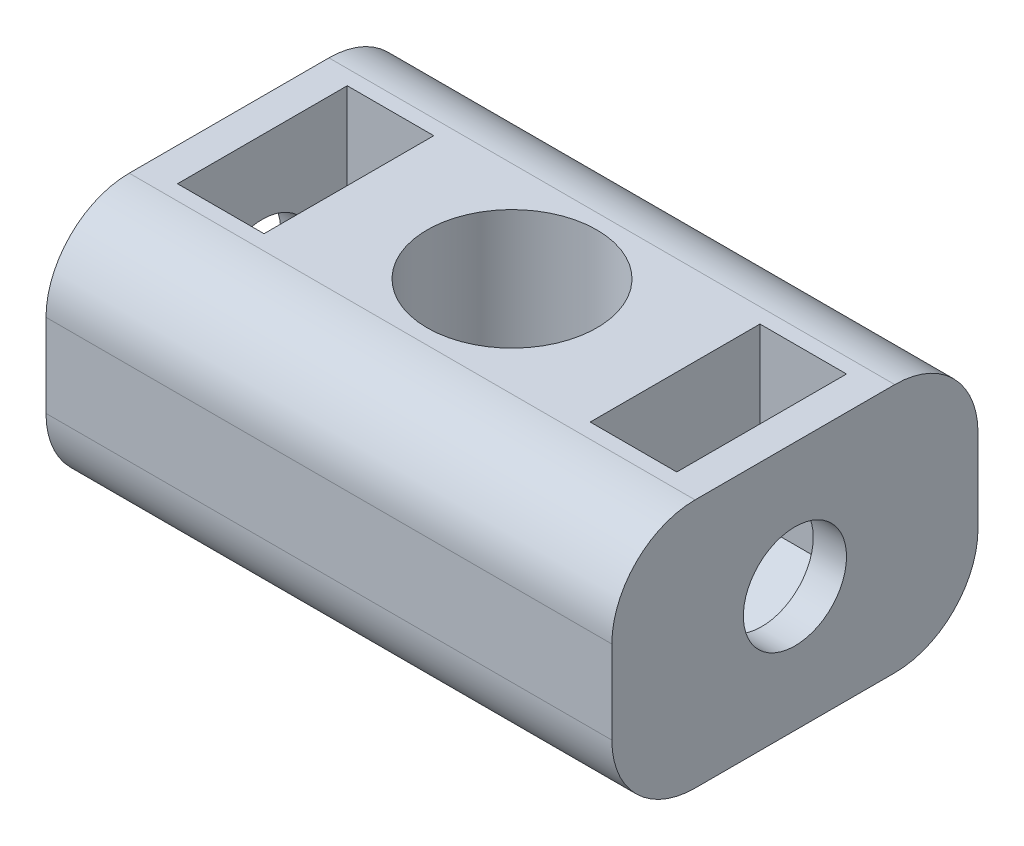
ISO-10303-21;
HEADER;
FILE_DESCRIPTION(('STEP AP214'),'2;1');
FILE_NAME('part.step','',(''),(''),'','','');
FILE_SCHEMA(('AUTOMOTIVE_DESIGN { 1 0 10303 214 1 1 1 1 }'));
ENDSEC;
DATA;
#1=APPLICATION_CONTEXT('core data for automotive mechanical design processes');
#2=APPLICATION_PROTOCOL_DEFINITION('international standard','automotive_design',2000,#1);
#3=PRODUCT_CONTEXT('',#1,'mechanical');
#4=PRODUCT('Part','Part','',(#3));
#5=PRODUCT_RELATED_PRODUCT_CATEGORY('part','',(#4));
#6=PRODUCT_DEFINITION_FORMATION('','',#4);
#7=PRODUCT_DEFINITION_CONTEXT('part definition',#1,'design');
#8=PRODUCT_DEFINITION('design','',#6,#7);
#9=PRODUCT_DEFINITION_SHAPE('','',#8);
#10=(LENGTH_UNIT() NAMED_UNIT(*) SI_UNIT(.MILLI.,.METRE.));
#11=(NAMED_UNIT(*) PLANE_ANGLE_UNIT() SI_UNIT($,.RADIAN.));
#12=(NAMED_UNIT(*) SI_UNIT($,.STERADIAN.) SOLID_ANGLE_UNIT());
#13=UNCERTAINTY_MEASURE_WITH_UNIT(LENGTH_MEASURE(1.E-05),#10,'distance_accuracy_value','');
#14=(GEOMETRIC_REPRESENTATION_CONTEXT(3) GLOBAL_UNCERTAINTY_ASSIGNED_CONTEXT((#13)) GLOBAL_UNIT_ASSIGNED_CONTEXT((#10,
#11,#12)) REPRESENTATION_CONTEXT('',''));
#15=CARTESIAN_POINT('',(0.,0.,0.));
#16=DIRECTION('',(0.,0.,1.));
#17=DIRECTION('',(1.,0.,0.));
#18=AXIS2_PLACEMENT_3D('',#15,#16,#17);
#19=CARTESIAN_POINT('',(0.,15.,0.));
#20=DIRECTION('',(0.,-1.,0.));
#21=DIRECTION('',(0.,0.,-1.));
#22=AXIS2_PLACEMENT_3D('',#19,#20,#21);
#23=PLANE('',#22);
#24=DIRECTION('',(0.,0.,-1.));
#25=VECTOR('',#24,1.);
#26=CARTESIAN_POINT('',(7.19999999999999,15.,-16.1));
#27=LINE('',#26,#25);
#28=CARTESIAN_POINT('',(7.2,15.,-5.9));
#29=VERTEX_POINT('',#28);
#30=CARTESIAN_POINT('',(7.19999999999999,15.,-16.1));
#31=VERTEX_POINT('',#30);
#32=EDGE_CURVE('E205',#29,#31,#27,.T.);
#33=ORIENTED_EDGE('',*,*,#32,.F.);
#34=DIRECTION('',(-1.,0.,0.));
#35=VECTOR('',#34,1.);
#36=CARTESIAN_POINT('',(7.2,15.,-5.9));
#37=LINE('',#36,#35);
#38=CARTESIAN_POINT('',(2.,15.,-5.9));
#39=VERTEX_POINT('',#38);
#40=EDGE_CURVE('E231',#29,#39,#37,.T.);
#41=ORIENTED_EDGE('',*,*,#40,.T.);
#42=DIRECTION('',(0.,0.,-1.));
#43=VECTOR('',#42,1.);
#44=CARTESIAN_POINT('',(1.99999999999999,15.,-16.1));
#45=LINE('',#44,#43);
#46=CARTESIAN_POINT('',(1.99999999999999,15.,-16.1));
#47=VERTEX_POINT('',#46);
#48=EDGE_CURVE('E221',#39,#47,#45,.T.);
#49=ORIENTED_EDGE('',*,*,#48,.T.);
#50=DIRECTION('',(-1.,0.,0.));
#51=VECTOR('',#50,1.);
#52=CARTESIAN_POINT('',(7.19999999999999,15.,-16.1));
#53=LINE('',#52,#51);
#54=EDGE_CURVE('E229',#31,#47,#53,.T.);
#55=ORIENTED_EDGE('',*,*,#54,.F.);
#56=EDGE_LOOP('',(#33,#41,#49,#55));
#57=FACE_BOUND('',#56,.T.);
#58=DIRECTION('',(0.,0.,1.));
#59=VECTOR('',#58,1.);
#60=CARTESIAN_POINT('',(0.,15.,0.));
#61=LINE('',#60,#59);
#62=CARTESIAN_POINT('',(0.,15.,-17.));
#63=VERTEX_POINT('',#62);
#64=CARTESIAN_POINT('',(0.,15.,-5.));
#65=VERTEX_POINT('',#64);
#66=EDGE_CURVE('E244',#63,#65,#61,.T.);
#67=ORIENTED_EDGE('',*,*,#66,.T.);
#68=DIRECTION('',(1.,0.,0.));
#69=VECTOR('',#68,1.);
#70=CARTESIAN_POINT('',(0.,15.,-5.));
#71=LINE('',#70,#69);
#72=CARTESIAN_POINT('',(34.,15.,-5.));
#73=VERTEX_POINT('',#72);
#74=EDGE_CURVE('E11',#65,#73,#71,.T.);
#75=ORIENTED_EDGE('',*,*,#74,.T.);
#76=DIRECTION('',(0.,0.,-1.));
#77=VECTOR('',#76,1.);
#78=CARTESIAN_POINT('',(34.,15.,0.));
#79=LINE('',#78,#77);
#80=CARTESIAN_POINT('',(34.,15.,-17.));
#81=VERTEX_POINT('',#80);
#82=EDGE_CURVE('E247',#73,#81,#79,.T.);
#83=ORIENTED_EDGE('',*,*,#82,.T.);
#84=DIRECTION('',(-1.,0.,0.));
#85=VECTOR('',#84,1.);
#86=CARTESIAN_POINT('',(0.,15.,-17.));
#87=LINE('',#86,#85);
#88=EDGE_CURVE('E45',#81,#63,#87,.T.);
#89=ORIENTED_EDGE('',*,*,#88,.T.);
#90=EDGE_LOOP('',(#67,#75,#83,#89));
#91=FACE_BOUND('',#90,.T.);
#92=CARTESIAN_POINT('',(17.,15.,-11.));
#93=DIRECTION('',(0.,1.,0.));
#94=DIRECTION('',(0.,0.,1.));
#95=AXIS2_PLACEMENT_3D('',#92,#93,#94);
#96=CIRCLE('',#95,5.1);
#97=CARTESIAN_POINT('',(17.,15.,-5.9));
#98=VERTEX_POINT('',#97);
#99=EDGE_CURVE('E238',#98,#98,#96,.T.);
#100=ORIENTED_EDGE('',*,*,#99,.F.);
#101=EDGE_LOOP('',(#100));
#102=FACE_BOUND('',#101,.T.);
#103=DIRECTION('',(0.,0.,1.));
#104=VECTOR('',#103,1.);
#105=CARTESIAN_POINT('',(26.8,15.,-5.9));
#106=LINE('',#105,#104);
#107=CARTESIAN_POINT('',(26.8,15.,-16.1));
#108=VERTEX_POINT('',#107);
#109=CARTESIAN_POINT('',(26.8,15.,-5.9));
#110=VERTEX_POINT('',#109);
#111=EDGE_CURVE('E176',#108,#110,#106,.T.);
#112=ORIENTED_EDGE('',*,*,#111,.F.);
#113=DIRECTION('',(1.,0.,0.));
#114=VECTOR('',#113,1.);
#115=CARTESIAN_POINT('',(26.8,15.,-16.1));
#116=LINE('',#115,#114);
#117=CARTESIAN_POINT('',(32.,15.,-16.1));
#118=VERTEX_POINT('',#117);
#119=EDGE_CURVE('E215',#108,#118,#116,.T.);
#120=ORIENTED_EDGE('',*,*,#119,.T.);
#121=DIRECTION('',(0.,0.,1.));
#122=VECTOR('',#121,1.);
#123=CARTESIAN_POINT('',(32.,15.,-5.9));
#124=LINE('',#123,#122);
#125=CARTESIAN_POINT('',(32.,15.,-5.9));
#126=VERTEX_POINT('',#125);
#127=EDGE_CURVE('E188',#118,#126,#124,.T.);
#128=ORIENTED_EDGE('',*,*,#127,.T.);
#129=DIRECTION('',(1.,0.,0.));
#130=VECTOR('',#129,1.);
#131=CARTESIAN_POINT('',(26.8,15.,-5.9));
#132=LINE('',#131,#130);
#133=EDGE_CURVE('E169',#110,#126,#132,.T.);
#134=ORIENTED_EDGE('',*,*,#133,.F.);
#135=EDGE_LOOP('',(#112,#120,#128,#134));
#136=FACE_BOUND('',#135,.T.);
#137=ADVANCED_FACE('F37',(#57,#91,#102,#136),#23,.F.);
#138=CARTESIAN_POINT('',(0.,0.,0.));
#139=DIRECTION('',(0.,-1.,0.));
#140=DIRECTION('',(0.,0.,-1.));
#141=AXIS2_PLACEMENT_3D('',#138,#139,#140);
#142=PLANE('',#141);
#143=DIRECTION('',(0.,0.,-1.));
#144=VECTOR('',#143,1.);
#145=CARTESIAN_POINT('',(34.,0.,0.));
#146=LINE('',#145,#144);
#147=CARTESIAN_POINT('',(34.,0.,-5.));
#148=VERTEX_POINT('',#147);
#149=CARTESIAN_POINT('',(34.,0.,-17.));
#150=VERTEX_POINT('',#149);
#151=EDGE_CURVE('E248',#148,#150,#146,.T.);
#152=ORIENTED_EDGE('',*,*,#151,.F.);
#153=DIRECTION('',(1.,0.,0.));
#154=VECTOR('',#153,1.);
#155=CARTESIAN_POINT('',(0.,0.,-5.));
#156=LINE('',#155,#154);
#157=CARTESIAN_POINT('',(0.,0.,-5.));
#158=VERTEX_POINT('',#157);
#159=EDGE_CURVE('E289',#148,#158,#156,.F.);
#160=ORIENTED_EDGE('',*,*,#159,.T.);
#161=DIRECTION('',(0.,0.,1.));
#162=VECTOR('',#161,1.);
#163=CARTESIAN_POINT('',(0.,0.,0.));
#164=LINE('',#163,#162);
#165=CARTESIAN_POINT('',(0.,0.,-17.));
#166=VERTEX_POINT('',#165);
#167=EDGE_CURVE('E241',#166,#158,#164,.T.);
#168=ORIENTED_EDGE('',*,*,#167,.F.);
#169=DIRECTION('',(-1.,0.,0.));
#170=VECTOR('',#169,1.);
#171=CARTESIAN_POINT('',(34.,0.,-17.));
#172=LINE('',#171,#170);
#173=EDGE_CURVE('E287',#166,#150,#172,.F.);
#174=ORIENTED_EDGE('',*,*,#173,.T.);
#175=EDGE_LOOP('',(#152,#160,#168,#174));
#176=FACE_BOUND('',#175,.T.);
#177=CARTESIAN_POINT('',(17.,0.,-11.));
#178=DIRECTION('',(0.,1.,0.));
#179=DIRECTION('',(0.,0.,1.));
#180=AXIS2_PLACEMENT_3D('',#177,#178,#179);
#181=CIRCLE('',#180,5.1);
#182=CARTESIAN_POINT('',(17.,0.,-5.9));
#183=VERTEX_POINT('',#182);
#184=EDGE_CURVE('E228',#183,#183,#181,.T.);
#185=ORIENTED_EDGE('',*,*,#184,.T.);
#186=EDGE_LOOP('',(#185));
#187=FACE_BOUND('',#186,.T.);
#188=ADVANCED_FACE('F325',(#176,#187),#142,.T.);
#189=CARTESIAN_POINT('',(0.,15.,0.));
#190=DIRECTION('',(1.,0.,0.));
#191=DIRECTION('',(0.,0.,-1.));
#192=AXIS2_PLACEMENT_3D('',#189,#190,#191);
#193=PLANE('',#192);
#194=CARTESIAN_POINT('',(0.,7.5,-11.));
#195=DIRECTION('',(-1.,0.,0.));
#196=DIRECTION('',(0.,0.,1.));
#197=AXIS2_PLACEMENT_3D('',#194,#195,#196);
#198=CIRCLE('',#197,3.1);
#199=CARTESIAN_POINT('',(0.,7.5,-7.89999999999999));
#200=VERTEX_POINT('',#199);
#201=EDGE_CURVE('E274',#200,#200,#198,.T.);
#202=ORIENTED_EDGE('',*,*,#201,.F.);
#203=EDGE_LOOP('',(#202));
#204=FACE_BOUND('',#203,.T.);
#205=ORIENTED_EDGE('',*,*,#167,.T.);
#206=CARTESIAN_POINT('',(0.,5.,-5.));
#207=DIRECTION('',(1.,0.,0.));
#208=DIRECTION('',(0.,0.,-1.));
#209=AXIS2_PLACEMENT_3D('',#206,#207,#208);
#210=CIRCLE('',#209,5.);
#211=CARTESIAN_POINT('',(0.,5.,0.));
#212=VERTEX_POINT('',#211);
#213=EDGE_CURVE('E295',#158,#212,#210,.F.);
#214=ORIENTED_EDGE('',*,*,#213,.T.);
#215=DIRECTION('',(0.,-1.,0.));
#216=VECTOR('',#215,1.);
#217=CARTESIAN_POINT('',(0.,15.,0.));
#218=LINE('',#217,#216);
#219=CARTESIAN_POINT('',(0.,10.,0.));
#220=VERTEX_POINT('',#219);
#221=EDGE_CURVE('E263',#220,#212,#218,.T.);
#222=ORIENTED_EDGE('',*,*,#221,.F.);
#223=CARTESIAN_POINT('',(0.,10.,-5.));
#224=DIRECTION('',(1.,0.,0.));
#225=DIRECTION('',(0.,0.,-1.));
#226=AXIS2_PLACEMENT_3D('',#223,#224,#225);
#227=CIRCLE('',#226,5.);
#228=EDGE_CURVE('E292',#220,#65,#227,.F.);
#229=ORIENTED_EDGE('',*,*,#228,.T.);
#230=ORIENTED_EDGE('',*,*,#66,.F.);
#231=CARTESIAN_POINT('',(0.,10.,-17.));
#232=DIRECTION('',(1.,0.,0.));
#233=DIRECTION('',(0.,0.,-1.));
#234=AXIS2_PLACEMENT_3D('',#231,#232,#233);
#235=CIRCLE('',#234,5.);
#236=CARTESIAN_POINT('',(0.,10.,-22.));
#237=VERTEX_POINT('',#236);
#238=EDGE_CURVE('E60',#63,#237,#235,.F.);
#239=ORIENTED_EDGE('',*,*,#238,.T.);
#240=DIRECTION('',(0.,-1.,0.));
#241=VECTOR('',#240,1.);
#242=CARTESIAN_POINT('',(0.,15.,-22.));
#243=LINE('',#242,#241);
#244=CARTESIAN_POINT('',(0.,5.,-22.));
#245=VERTEX_POINT('',#244);
#246=EDGE_CURVE('E251',#237,#245,#243,.T.);
#247=ORIENTED_EDGE('',*,*,#246,.T.);
#248=CARTESIAN_POINT('',(0.,5.,-17.));
#249=DIRECTION('',(1.,0.,0.));
#250=DIRECTION('',(0.,0.,-1.));
#251=AXIS2_PLACEMENT_3D('',#248,#249,#250);
#252=CIRCLE('',#251,5.);
#253=EDGE_CURVE('E52',#245,#166,#252,.F.);
#254=ORIENTED_EDGE('',*,*,#253,.T.);
#255=EDGE_LOOP('',(#205,#214,#222,#229,#230,#239,#247,#254));
#256=FACE_BOUND('',#255,.T.);
#257=ADVANCED_FACE('F308',(#204,#256),#193,.F.);
#258=CARTESIAN_POINT('',(0.,15.,0.));
#259=DIRECTION('',(0.,0.,-1.));
#260=DIRECTION('',(-1.,0.,0.));
#261=AXIS2_PLACEMENT_3D('',#258,#259,#260);
#262=PLANE('',#261);
#263=ORIENTED_EDGE('',*,*,#221,.T.);
#264=DIRECTION('',(1.,0.,0.));
#265=VECTOR('',#264,1.);
#266=CARTESIAN_POINT('',(34.,5.,0.));
#267=LINE('',#266,#265);
#268=CARTESIAN_POINT('',(34.,5.,0.));
#269=VERTEX_POINT('',#268);
#270=EDGE_CURVE('E276',#212,#269,#267,.T.);
#271=ORIENTED_EDGE('',*,*,#270,.T.);
#272=DIRECTION('',(0.,-1.,0.));
#273=VECTOR('',#272,1.);
#274=CARTESIAN_POINT('',(34.,15.,0.));
#275=LINE('',#274,#273);
#276=CARTESIAN_POINT('',(34.,10.,0.));
#277=VERTEX_POINT('',#276);
#278=EDGE_CURVE('E260',#277,#269,#275,.T.);
#279=ORIENTED_EDGE('',*,*,#278,.F.);
#280=DIRECTION('',(1.,0.,0.));
#281=VECTOR('',#280,1.);
#282=CARTESIAN_POINT('',(0.,10.,0.));
#283=LINE('',#282,#281);
#284=EDGE_CURVE('E266',#277,#220,#283,.F.);
#285=ORIENTED_EDGE('',*,*,#284,.T.);
#286=EDGE_LOOP('',(#263,#271,#279,#285));
#287=FACE_BOUND('',#286,.T.);
#288=ADVANCED_FACE('F334',(#287),#262,.F.);
#289=CARTESIAN_POINT('',(34.,15.,0.));
#290=DIRECTION('',(-1.,0.,0.));
#291=DIRECTION('',(0.,0.,1.));
#292=AXIS2_PLACEMENT_3D('',#289,#290,#291);
#293=PLANE('',#292);
#294=CARTESIAN_POINT('',(34.,7.5,-11.));
#295=DIRECTION('',(1.,0.,0.));
#296=DIRECTION('',(0.,0.,-1.));
#297=AXIS2_PLACEMENT_3D('',#294,#295,#296);
#298=CIRCLE('',#297,3.1);
#299=CARTESIAN_POINT('',(34.,7.5,-14.1));
#300=VERTEX_POINT('',#299);
#301=EDGE_CURVE('E270',#300,#300,#298,.T.);
#302=ORIENTED_EDGE('',*,*,#301,.F.);
#303=EDGE_LOOP('',(#302));
#304=FACE_BOUND('',#303,.T.);
#305=ORIENTED_EDGE('',*,*,#278,.T.);
#306=CARTESIAN_POINT('',(34.,5.,-5.));
#307=DIRECTION('',(-1.,0.,0.));
#308=DIRECTION('',(0.,0.,1.));
#309=AXIS2_PLACEMENT_3D('',#306,#307,#308);
#310=CIRCLE('',#309,5.);
#311=EDGE_CURVE('E285',#269,#148,#310,.F.);
#312=ORIENTED_EDGE('',*,*,#311,.T.);
#313=ORIENTED_EDGE('',*,*,#151,.T.);
#314=CARTESIAN_POINT('',(34.,5.,-17.));
#315=DIRECTION('',(-1.,0.,0.));
#316=DIRECTION('',(0.,0.,1.));
#317=AXIS2_PLACEMENT_3D('',#314,#315,#316);
#318=CIRCLE('',#317,5.);
#319=CARTESIAN_POINT('',(34.,5.,-22.));
#320=VERTEX_POINT('',#319);
#321=EDGE_CURVE('E283',#150,#320,#318,.F.);
#322=ORIENTED_EDGE('',*,*,#321,.T.);
#323=DIRECTION('',(0.,-1.,0.));
#324=VECTOR('',#323,1.);
#325=CARTESIAN_POINT('',(34.,15.,-22.));
#326=LINE('',#325,#324);
#327=CARTESIAN_POINT('',(34.,10.,-22.));
#328=VERTEX_POINT('',#327);
#329=EDGE_CURVE('E257',#328,#320,#326,.T.);
#330=ORIENTED_EDGE('',*,*,#329,.F.);
#331=CARTESIAN_POINT('',(34.,10.,-17.));
#332=DIRECTION('',(-1.,0.,0.));
#333=DIRECTION('',(0.,0.,1.));
#334=AXIS2_PLACEMENT_3D('',#331,#332,#333);
#335=CIRCLE('',#334,5.);
#336=EDGE_CURVE('E279',#328,#81,#335,.F.);
#337=ORIENTED_EDGE('',*,*,#336,.T.);
#338=ORIENTED_EDGE('',*,*,#82,.F.);
#339=CARTESIAN_POINT('',(34.,10.,-5.));
#340=DIRECTION('',(-1.,0.,0.));
#341=DIRECTION('',(0.,0.,1.));
#342=AXIS2_PLACEMENT_3D('',#339,#340,#341);
#343=CIRCLE('',#342,5.);
#344=EDGE_CURVE('E281',#73,#277,#343,.F.);
#345=ORIENTED_EDGE('',*,*,#344,.T.);
#346=EDGE_LOOP('',(#305,#312,#313,#322,#330,#337,#338,#345));
#347=FACE_BOUND('',#346,.T.);
#348=ADVANCED_FACE('F315',(#304,#347),#293,.F.);
#349=CARTESIAN_POINT('',(0.,15.,-22.));
#350=DIRECTION('',(0.,0.,1.));
#351=DIRECTION('',(1.,0.,0.));
#352=AXIS2_PLACEMENT_3D('',#349,#350,#351);
#353=PLANE('',#352);
#354=ORIENTED_EDGE('',*,*,#329,.T.);
#355=DIRECTION('',(-1.,0.,0.));
#356=VECTOR('',#355,1.);
#357=CARTESIAN_POINT('',(0.,5.,-22.));
#358=LINE('',#357,#356);
#359=EDGE_CURVE('E299',#320,#245,#358,.T.);
#360=ORIENTED_EDGE('',*,*,#359,.T.);
#361=ORIENTED_EDGE('',*,*,#246,.F.);
#362=DIRECTION('',(-1.,0.,0.));
#363=VECTOR('',#362,1.);
#364=CARTESIAN_POINT('',(0.,10.,-22.));
#365=LINE('',#364,#363);
#366=EDGE_CURVE('E297',#237,#328,#365,.F.);
#367=ORIENTED_EDGE('',*,*,#366,.T.);
#368=EDGE_LOOP('',(#354,#360,#361,#367));
#369=FACE_BOUND('',#368,.T.);
#370=ADVANCED_FACE('F320',(#369),#353,.F.);
#371=CARTESIAN_POINT('',(17.,15.,-11.));
#372=DIRECTION('',(0.,-1.,0.));
#373=DIRECTION('',(0.,0.,-1.));
#374=AXIS2_PLACEMENT_3D('',#371,#372,#373);
#375=CYLINDRICAL_SURFACE('',#374,5.1);
#376=ORIENTED_EDGE('',*,*,#99,.T.);
#377=EDGE_LOOP('',(#376));
#378=FACE_BOUND('',#377,.T.);
#379=ORIENTED_EDGE('',*,*,#184,.F.);
#380=EDGE_LOOP('',(#379));
#381=FACE_BOUND('',#380,.T.);
#382=ADVANCED_FACE('F354',(#378,#381),#375,.F.);
#383=CARTESIAN_POINT('',(7.19999999999999,4.5555136271329,-16.1));
#384=DIRECTION('',(0.,-0.866025403784439,-0.5));
#385=DIRECTION('',(0.,0.5,-0.866025403784439));
#386=AXIS2_PLACEMENT_3D('',#383,#384,#385);
#387=PLANE('',#386);
#388=DIRECTION('',(0.,-0.5,0.866025403784439));
#389=VECTOR('',#388,1.);
#390=CARTESIAN_POINT('',(1.99999999999999,4.5555136271329,-16.1));
#391=LINE('',#390,#389);
#392=CARTESIAN_POINT('',(1.99999999999999,4.5555136271329,-16.1));
#393=VERTEX_POINT('',#392);
#394=CARTESIAN_POINT('',(2.,1.61102725426582,-11.));
#395=VERTEX_POINT('',#394);
#396=EDGE_CURVE('E211',#393,#395,#391,.T.);
#397=ORIENTED_EDGE('',*,*,#396,.T.);
#398=DIRECTION('',(-1.,0.,0.));
#399=VECTOR('',#398,1.);
#400=CARTESIAN_POINT('',(7.2,1.61102725426582,-11.));
#401=LINE('',#400,#399);
#402=CARTESIAN_POINT('',(7.2,1.61102725426582,-11.));
#403=VERTEX_POINT('',#402);
#404=EDGE_CURVE('E210',#403,#395,#401,.T.);
#405=ORIENTED_EDGE('',*,*,#404,.F.);
#406=DIRECTION('',(0.,-0.5,0.866025403784439));
#407=VECTOR('',#406,1.);
#408=CARTESIAN_POINT('',(7.19999999999999,4.5555136271329,-16.1));
#409=LINE('',#408,#407);
#410=CARTESIAN_POINT('',(7.19999999999999,4.5555136271329,-16.1));
#411=VERTEX_POINT('',#410);
#412=EDGE_CURVE('E196',#411,#403,#409,.T.);
#413=ORIENTED_EDGE('',*,*,#412,.F.);
#414=DIRECTION('',(-1.,0.,0.));
#415=VECTOR('',#414,1.);
#416=CARTESIAN_POINT('',(7.19999999999999,4.5555136271329,-16.1));
#417=LINE('',#416,#415);
#418=EDGE_CURVE('E226',#411,#393,#417,.T.);
#419=ORIENTED_EDGE('',*,*,#418,.T.);
#420=EDGE_LOOP('',(#397,#405,#413,#419));
#421=FACE_BOUND('',#420,.T.);
#422=ADVANCED_FACE('F361',(#421),#387,.F.);
#423=CARTESIAN_POINT('',(7.19999999999999,10.4444863728671,-16.1));
#424=DIRECTION('',(0.,0.,-1.));
#425=DIRECTION('',(0.,1.,0.));
#426=AXIS2_PLACEMENT_3D('',#423,#424,#425);
#427=PLANE('',#426);
#428=DIRECTION('',(0.,-1.,0.));
#429=VECTOR('',#428,1.);
#430=CARTESIAN_POINT('',(1.99999999999999,10.4444863728671,-16.1));
#431=LINE('',#430,#429);
#432=EDGE_CURVE('E200',#47,#393,#431,.T.);
#433=ORIENTED_EDGE('',*,*,#432,.T.);
#434=ORIENTED_EDGE('',*,*,#418,.F.);
#435=DIRECTION('',(0.,-1.,0.));
#436=VECTOR('',#435,1.);
#437=CARTESIAN_POINT('',(7.19999999999999,10.4444863728671,-16.1));
#438=LINE('',#437,#436);
#439=EDGE_CURVE('E208',#31,#411,#438,.T.);
#440=ORIENTED_EDGE('',*,*,#439,.F.);
#441=ORIENTED_EDGE('',*,*,#54,.T.);
#442=EDGE_LOOP('',(#433,#434,#440,#441));
#443=FACE_BOUND('',#442,.T.);
#444=ADVANCED_FACE('F366',(#443),#427,.F.);
#445=CARTESIAN_POINT('',(7.2,15.,-5.9));
#446=DIRECTION('',(0.,0.,1.));
#447=DIRECTION('',(0.,-1.,0.));
#448=AXIS2_PLACEMENT_3D('',#445,#446,#447);
#449=PLANE('',#448);
#450=DIRECTION('',(0.,1.,0.));
#451=VECTOR('',#450,1.);
#452=CARTESIAN_POINT('',(2.,15.,-5.9));
#453=LINE('',#452,#451);
#454=CARTESIAN_POINT('',(2.,4.55551362713291,-5.9));
#455=VERTEX_POINT('',#454);
#456=EDGE_CURVE('E218',#455,#39,#453,.T.);
#457=ORIENTED_EDGE('',*,*,#456,.T.);
#458=ORIENTED_EDGE('',*,*,#40,.F.);
#459=DIRECTION('',(0.,1.,0.));
#460=VECTOR('',#459,1.);
#461=CARTESIAN_POINT('',(7.2,4.55551362713291,-5.9));
#462=LINE('',#461,#460);
#463=CARTESIAN_POINT('',(7.2,4.55551362713291,-5.9));
#464=VERTEX_POINT('',#463);
#465=EDGE_CURVE('E203',#464,#29,#462,.T.);
#466=ORIENTED_EDGE('',*,*,#465,.F.);
#467=DIRECTION('',(-1.,0.,0.));
#468=VECTOR('',#467,1.);
#469=CARTESIAN_POINT('',(7.2,4.55551362713291,-5.9));
#470=LINE('',#469,#468);
#471=EDGE_CURVE('E234',#464,#455,#470,.T.);
#472=ORIENTED_EDGE('',*,*,#471,.T.);
#473=EDGE_LOOP('',(#457,#458,#466,#472));
#474=FACE_BOUND('',#473,.T.);
#475=ADVANCED_FACE('F374',(#474),#449,.F.);
#476=CARTESIAN_POINT('',(7.2,1.61102725426582,-11.));
#477=DIRECTION('',(0.,-0.866025403784438,0.500000000000001));
#478=DIRECTION('',(0.,-0.500000000000001,-0.866025403784438));
#479=AXIS2_PLACEMENT_3D('',#476,#477,#478);
#480=PLANE('',#479);
#481=DIRECTION('',(0.,0.500000000000001,0.866025403784438));
#482=VECTOR('',#481,1.);
#483=CARTESIAN_POINT('',(2.,1.61102725426582,-11.));
#484=LINE('',#483,#482);
#485=EDGE_CURVE('E214',#395,#455,#484,.T.);
#486=ORIENTED_EDGE('',*,*,#485,.T.);
#487=ORIENTED_EDGE('',*,*,#471,.F.);
#488=DIRECTION('',(0.,0.500000000000001,0.866025403784438));
#489=VECTOR('',#488,1.);
#490=CARTESIAN_POINT('',(7.2,1.61102725426582,-11.));
#491=LINE('',#490,#489);
#492=EDGE_CURVE('E199',#403,#464,#491,.T.);
#493=ORIENTED_EDGE('',*,*,#492,.F.);
#494=ORIENTED_EDGE('',*,*,#404,.T.);
#495=EDGE_LOOP('',(#486,#487,#493,#494));
#496=FACE_BOUND('',#495,.T.);
#497=ADVANCED_FACE('F378',(#496),#480,.F.);
#498=CARTESIAN_POINT('',(7.2,0.,0.));
#499=DIRECTION('',(-1.,0.,0.));
#500=DIRECTION('',(0.,0.,1.));
#501=AXIS2_PLACEMENT_3D('',#498,#499,#500);
#502=PLANE('',#501);
#503=ORIENTED_EDGE('',*,*,#412,.T.);
#504=ORIENTED_EDGE('',*,*,#492,.T.);
#505=ORIENTED_EDGE('',*,*,#465,.T.);
#506=ORIENTED_EDGE('',*,*,#32,.T.);
#507=ORIENTED_EDGE('',*,*,#439,.T.);
#508=EDGE_LOOP('',(#503,#504,#505,#506,#507));
#509=FACE_BOUND('',#508,.T.);
#510=ADVANCED_FACE('F381',(#509),#502,.T.);
#511=CARTESIAN_POINT('',(2.,0.,0.));
#512=DIRECTION('',(-1.,0.,0.));
#513=DIRECTION('',(0.,0.,1.));
#514=AXIS2_PLACEMENT_3D('',#511,#512,#513);
#515=PLANE('',#514);
#516=CARTESIAN_POINT('',(2.,7.5,-11.));
#517=DIRECTION('',(-1.,0.,0.));
#518=DIRECTION('',(0.,0.,1.));
#519=AXIS2_PLACEMENT_3D('',#516,#517,#518);
#520=CIRCLE('',#519,3.1);
#521=CARTESIAN_POINT('',(2.,7.5,-7.89999999999999));
#522=VERTEX_POINT('',#521);
#523=EDGE_CURVE('E271',#522,#522,#520,.T.);
#524=ORIENTED_EDGE('',*,*,#523,.T.);
#525=EDGE_LOOP('',(#524));
#526=FACE_BOUND('',#525,.T.);
#527=ORIENTED_EDGE('',*,*,#396,.F.);
#528=ORIENTED_EDGE('',*,*,#432,.F.);
#529=ORIENTED_EDGE('',*,*,#48,.F.);
#530=ORIENTED_EDGE('',*,*,#456,.F.);
#531=ORIENTED_EDGE('',*,*,#485,.F.);
#532=EDGE_LOOP('',(#527,#528,#529,#530,#531));
#533=FACE_BOUND('',#532,.T.);
#534=ADVANCED_FACE('F386',(#526,#533),#515,.F.);
#535=CARTESIAN_POINT('',(26.8,4.5555136271329,-16.1));
#536=DIRECTION('',(0.,0.,-1.));
#537=DIRECTION('',(-1.,0.,0.));
#538=AXIS2_PLACEMENT_3D('',#535,#536,#537);
#539=PLANE('',#538);
#540=DIRECTION('',(0.,1.,0.));
#541=VECTOR('',#540,1.);
#542=CARTESIAN_POINT('',(32.,4.5555136271329,-16.1));
#543=LINE('',#542,#541);
#544=CARTESIAN_POINT('',(32.,4.5555136271329,-16.1));
#545=VERTEX_POINT('',#544);
#546=EDGE_CURVE('E186',#545,#118,#543,.T.);
#547=ORIENTED_EDGE('',*,*,#546,.T.);
#548=ORIENTED_EDGE('',*,*,#119,.F.);
#549=DIRECTION('',(0.,1.,0.));
#550=VECTOR('',#549,1.);
#551=CARTESIAN_POINT('',(26.8,4.5555136271329,-16.1));
#552=LINE('',#551,#550);
#553=CARTESIAN_POINT('',(26.8,4.5555136271329,-16.1));
#554=VERTEX_POINT('',#553);
#555=EDGE_CURVE('E183',#554,#108,#552,.T.);
#556=ORIENTED_EDGE('',*,*,#555,.F.);
#557=DIRECTION('',(1.,0.,0.));
#558=VECTOR('',#557,1.);
#559=CARTESIAN_POINT('',(26.8,4.5555136271329,-16.1));
#560=LINE('',#559,#558);
#561=EDGE_CURVE('E456',#554,#545,#560,.T.);
#562=ORIENTED_EDGE('',*,*,#561,.T.);
#563=EDGE_LOOP('',(#547,#548,#556,#562));
#564=FACE_BOUND('',#563,.T.);
#565=ADVANCED_FACE('F389',(#564),#539,.F.);
#566=CARTESIAN_POINT('',(26.8,4.5555136271329,-16.1));
#567=DIRECTION('',(0.,-0.866025403784439,-0.5));
#568=DIRECTION('',(0.,0.5,-0.866025403784439));
#569=AXIS2_PLACEMENT_3D('',#566,#567,#568);
#570=PLANE('',#569);
#571=DIRECTION('',(0.,0.5,-0.866025403784439));
#572=VECTOR('',#571,1.);
#573=CARTESIAN_POINT('',(32.,4.5555136271329,-16.1));
#574=LINE('',#573,#572);
#575=CARTESIAN_POINT('',(32.,1.61102725426582,-11.));
#576=VERTEX_POINT('',#575);
#577=EDGE_CURVE('E450',#576,#545,#574,.T.);
#578=ORIENTED_EDGE('',*,*,#577,.T.);
#579=ORIENTED_EDGE('',*,*,#561,.F.);
#580=DIRECTION('',(0.,0.5,-0.866025403784439));
#581=VECTOR('',#580,1.);
#582=CARTESIAN_POINT('',(26.8,4.5555136271329,-16.1));
#583=LINE('',#582,#581);
#584=CARTESIAN_POINT('',(26.8,1.61102725426582,-11.));
#585=VERTEX_POINT('',#584);
#586=EDGE_CURVE('E192',#585,#554,#583,.T.);
#587=ORIENTED_EDGE('',*,*,#586,.F.);
#588=DIRECTION('',(1.,0.,0.));
#589=VECTOR('',#588,1.);
#590=CARTESIAN_POINT('',(26.8,1.61102725426582,-11.));
#591=LINE('',#590,#589);
#592=EDGE_CURVE('E190',#585,#576,#591,.T.);
#593=ORIENTED_EDGE('',*,*,#592,.T.);
#594=EDGE_LOOP('',(#578,#579,#587,#593));
#595=FACE_BOUND('',#594,.T.);
#596=ADVANCED_FACE('F399',(#595),#570,.F.);
#597=CARTESIAN_POINT('',(26.8,1.61102725426582,-11.));
#598=DIRECTION('',(0.,-0.866025403784438,0.500000000000001));
#599=DIRECTION('',(0.,-0.500000000000001,-0.866025403784438));
#600=AXIS2_PLACEMENT_3D('',#597,#598,#599);
#601=PLANE('',#600);
#602=DIRECTION('',(0.,-0.500000000000001,-0.866025403784438));
#603=VECTOR('',#602,1.);
#604=CARTESIAN_POINT('',(32.,1.61102725426582,-11.));
#605=LINE('',#604,#603);
#606=CARTESIAN_POINT('',(32.,4.55551362713291,-5.90000000000001));
#607=VERTEX_POINT('',#606);
#608=EDGE_CURVE('E447',#607,#576,#605,.T.);
#609=ORIENTED_EDGE('',*,*,#608,.T.);
#610=ORIENTED_EDGE('',*,*,#592,.F.);
#611=DIRECTION('',(0.,-0.500000000000001,-0.866025403784438));
#612=VECTOR('',#611,1.);
#613=CARTESIAN_POINT('',(26.8,1.61102725426582,-11.));
#614=LINE('',#613,#612);
#615=CARTESIAN_POINT('',(26.8,4.55551362713291,-5.90000000000001));
#616=VERTEX_POINT('',#615);
#617=EDGE_CURVE('E175',#616,#585,#614,.T.);
#618=ORIENTED_EDGE('',*,*,#617,.F.);
#619=DIRECTION('',(1.,0.,0.));
#620=VECTOR('',#619,1.);
#621=CARTESIAN_POINT('',(26.8,4.55551362713291,-5.90000000000001));
#622=LINE('',#621,#620);
#623=EDGE_CURVE('E171',#616,#607,#622,.T.);
#624=ORIENTED_EDGE('',*,*,#623,.T.);
#625=EDGE_LOOP('',(#609,#610,#618,#624));
#626=FACE_BOUND('',#625,.T.);
#627=ADVANCED_FACE('F396',(#626),#601,.F.);
#628=CARTESIAN_POINT('',(26.8,15.,-5.9));
#629=DIRECTION('',(0.,0.,1.));
#630=DIRECTION('',(0.,-1.,0.));
#631=AXIS2_PLACEMENT_3D('',#628,#629,#630);
#632=PLANE('',#631);
#633=DIRECTION('',(0.,-1.,0.));
#634=VECTOR('',#633,1.);
#635=CARTESIAN_POINT('',(32.,15.,-5.9));
#636=LINE('',#635,#634);
#637=EDGE_CURVE('E445',#126,#607,#636,.T.);
#638=ORIENTED_EDGE('',*,*,#637,.T.);
#639=ORIENTED_EDGE('',*,*,#623,.F.);
#640=DIRECTION('',(0.,-1.,0.));
#641=VECTOR('',#640,1.);
#642=CARTESIAN_POINT('',(26.8,15.,-5.9));
#643=LINE('',#642,#641);
#644=EDGE_CURVE('E164',#110,#616,#643,.T.);
#645=ORIENTED_EDGE('',*,*,#644,.F.);
#646=ORIENTED_EDGE('',*,*,#133,.T.);
#647=EDGE_LOOP('',(#638,#639,#645,#646));
#648=FACE_BOUND('',#647,.T.);
#649=ADVANCED_FACE('F167',(#648),#632,.F.);
#650=CARTESIAN_POINT('',(26.8,0.,0.));
#651=DIRECTION('',(1.,0.,0.));
#652=DIRECTION('',(0.,0.,-1.));
#653=AXIS2_PLACEMENT_3D('',#650,#651,#652);
#654=PLANE('',#653);
#655=ORIENTED_EDGE('',*,*,#111,.T.);
#656=ORIENTED_EDGE('',*,*,#644,.T.);
#657=ORIENTED_EDGE('',*,*,#617,.T.);
#658=ORIENTED_EDGE('',*,*,#586,.T.);
#659=ORIENTED_EDGE('',*,*,#555,.T.);
#660=EDGE_LOOP('',(#655,#656,#657,#658,#659));
#661=FACE_BOUND('',#660,.T.);
#662=ADVANCED_FACE('F180',(#661),#654,.T.);
#663=CARTESIAN_POINT('',(32.,0.,0.));
#664=DIRECTION('',(1.,0.,0.));
#665=DIRECTION('',(0.,0.,-1.));
#666=AXIS2_PLACEMENT_3D('',#663,#664,#665);
#667=PLANE('',#666);
#668=CARTESIAN_POINT('',(32.,7.5,-11.));
#669=DIRECTION('',(1.,0.,0.));
#670=DIRECTION('',(0.,0.,-1.));
#671=AXIS2_PLACEMENT_3D('',#668,#669,#670);
#672=CIRCLE('',#671,3.1);
#673=CARTESIAN_POINT('',(32.,7.5,-14.1));
#674=VERTEX_POINT('',#673);
#675=EDGE_CURVE('E267',#674,#674,#672,.T.);
#676=ORIENTED_EDGE('',*,*,#675,.T.);
#677=EDGE_LOOP('',(#676));
#678=FACE_BOUND('',#677,.T.);
#679=ORIENTED_EDGE('',*,*,#127,.F.);
#680=ORIENTED_EDGE('',*,*,#546,.F.);
#681=ORIENTED_EDGE('',*,*,#577,.F.);
#682=ORIENTED_EDGE('',*,*,#608,.F.);
#683=ORIENTED_EDGE('',*,*,#637,.F.);
#684=EDGE_LOOP('',(#679,#680,#681,#682,#683));
#685=FACE_BOUND('',#684,.T.);
#686=ADVANCED_FACE('F407',(#678,#685),#667,.F.);
#687=CARTESIAN_POINT('',(30.,7.5,-11.));
#688=DIRECTION('',(1.,0.,0.));
#689=DIRECTION('',(0.,0.,-1.));
#690=AXIS2_PLACEMENT_3D('',#687,#688,#689);
#691=CYLINDRICAL_SURFACE('',#690,3.1);
#692=ORIENTED_EDGE('',*,*,#301,.T.);
#693=EDGE_LOOP('',(#692));
#694=FACE_BOUND('',#693,.T.);
#695=ORIENTED_EDGE('',*,*,#675,.F.);
#696=EDGE_LOOP('',(#695));
#697=FACE_BOUND('',#696,.T.);
#698=ADVANCED_FACE('F410',(#694,#697),#691,.F.);
#699=CARTESIAN_POINT('',(4.,7.5,-11.));
#700=DIRECTION('',(-1.,0.,0.));
#701=DIRECTION('',(0.,0.,1.));
#702=AXIS2_PLACEMENT_3D('',#699,#700,#701);
#703=CYLINDRICAL_SURFACE('',#702,3.1);
#704=ORIENTED_EDGE('',*,*,#201,.T.);
#705=EDGE_LOOP('',(#704));
#706=FACE_BOUND('',#705,.T.);
#707=ORIENTED_EDGE('',*,*,#523,.F.);
#708=EDGE_LOOP('',(#707));
#709=FACE_BOUND('',#708,.T.);
#710=ADVANCED_FACE('F416',(#706,#709),#703,.F.);
#711=CARTESIAN_POINT('',(0.,5.,-5.));
#712=DIRECTION('',(-1.,0.,0.));
#713=DIRECTION('',(0.,0.,1.));
#714=AXIS2_PLACEMENT_3D('',#711,#712,#713);
#715=CYLINDRICAL_SURFACE('',#714,5.);
#716=ORIENTED_EDGE('',*,*,#213,.F.);
#717=ORIENTED_EDGE('',*,*,#159,.F.);
#718=ORIENTED_EDGE('',*,*,#311,.F.);
#719=ORIENTED_EDGE('',*,*,#270,.F.);
#720=EDGE_LOOP('',(#716,#717,#718,#719));
#721=FACE_BOUND('',#720,.T.);
#722=ADVANCED_FACE('F331',(#721),#715,.T.);
#723=CARTESIAN_POINT('',(0.,5.,-17.));
#724=DIRECTION('',(1.,0.,0.));
#725=DIRECTION('',(0.,0.,-1.));
#726=AXIS2_PLACEMENT_3D('',#723,#724,#725);
#727=CYLINDRICAL_SURFACE('',#726,5.);
#728=ORIENTED_EDGE('',*,*,#321,.F.);
#729=ORIENTED_EDGE('',*,*,#173,.F.);
#730=ORIENTED_EDGE('',*,*,#253,.F.);
#731=ORIENTED_EDGE('',*,*,#359,.F.);
#732=EDGE_LOOP('',(#728,#729,#730,#731));
#733=FACE_BOUND('',#732,.T.);
#734=ADVANCED_FACE('F329',(#733),#727,.T.);
#735=CARTESIAN_POINT('',(0.,10.,-5.));
#736=DIRECTION('',(1.,0.,0.));
#737=DIRECTION('',(0.,0.,-1.));
#738=AXIS2_PLACEMENT_3D('',#735,#736,#737);
#739=CYLINDRICAL_SURFACE('',#738,5.);
#740=ORIENTED_EDGE('',*,*,#228,.F.);
#741=ORIENTED_EDGE('',*,*,#284,.F.);
#742=ORIENTED_EDGE('',*,*,#344,.F.);
#743=ORIENTED_EDGE('',*,*,#74,.F.);
#744=EDGE_LOOP('',(#740,#741,#742,#743));
#745=FACE_BOUND('',#744,.T.);
#746=ADVANCED_FACE('F313',(#745),#739,.T.);
#747=CARTESIAN_POINT('',(0.,10.,-17.));
#748=DIRECTION('',(-1.,0.,0.));
#749=DIRECTION('',(0.,0.,1.));
#750=AXIS2_PLACEMENT_3D('',#747,#748,#749);
#751=CYLINDRICAL_SURFACE('',#750,5.);
#752=ORIENTED_EDGE('',*,*,#336,.F.);
#753=ORIENTED_EDGE('',*,*,#366,.F.);
#754=ORIENTED_EDGE('',*,*,#238,.F.);
#755=ORIENTED_EDGE('',*,*,#88,.F.);
#756=EDGE_LOOP('',(#752,#753,#754,#755));
#757=FACE_BOUND('',#756,.T.);
#758=ADVANCED_FACE('F39',(#757),#751,.T.);
#759=CLOSED_SHELL('',(#137,#188,#257,#288,#348,#370,#382,#422,#444,#475,#497,#510,#534,#565,
#596,#627,#649,#662,#686,#698,#710,#722,#734,#746,#758));
#760=MANIFOLD_SOLID_BREP('B2',#759);
#761=ADVANCED_BREP_SHAPE_REPRESENTATION('',(#18,#760),#14);
#762=SHAPE_DEFINITION_REPRESENTATION(#9,#761);
ENDSEC;
END-ISO-10303-21;
